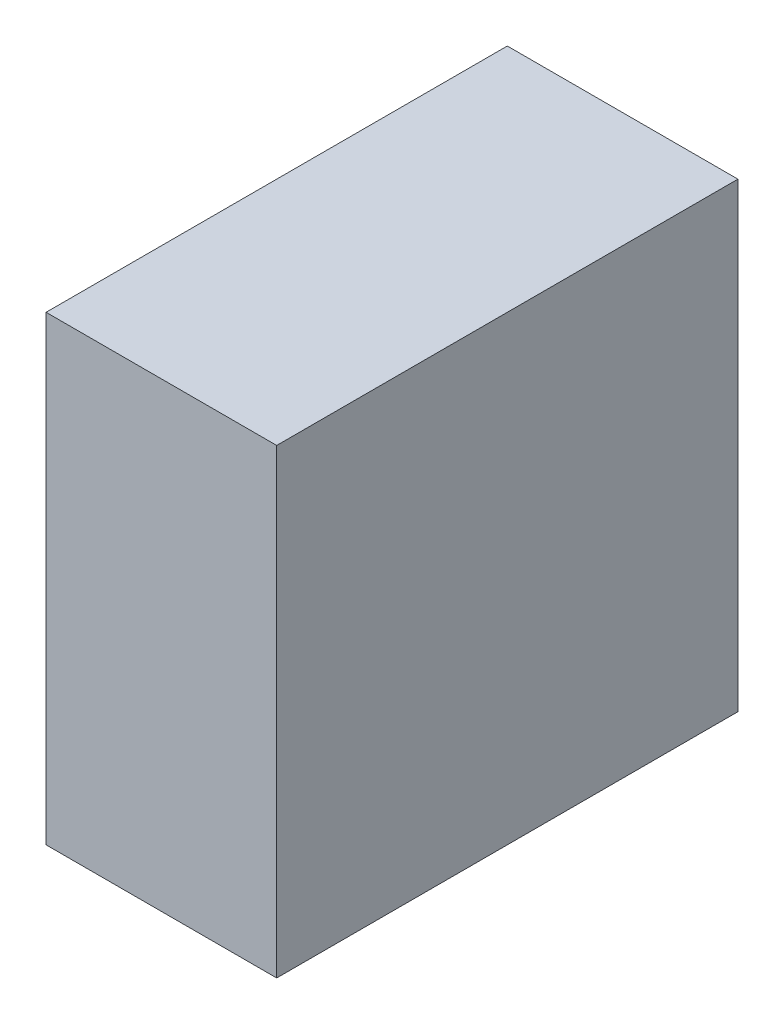
ISO-10303-21;
HEADER;
FILE_DESCRIPTION(('STEP AP214'),'2;1');
FILE_NAME('part.step','',(''),(''),'','','');
FILE_SCHEMA(('AUTOMOTIVE_DESIGN { 1 0 10303 214 1 1 1 1 }'));
ENDSEC;
DATA;
#1=APPLICATION_CONTEXT('core data for automotive mechanical design processes');
#2=APPLICATION_PROTOCOL_DEFINITION('international standard','automotive_design',2000,#1);
#3=PRODUCT_CONTEXT('',#1,'mechanical');
#4=PRODUCT('Part','Part','',(#3));
#5=PRODUCT_RELATED_PRODUCT_CATEGORY('part','',(#4));
#6=PRODUCT_DEFINITION_FORMATION('','',#4);
#7=PRODUCT_DEFINITION_CONTEXT('part definition',#1,'design');
#8=PRODUCT_DEFINITION('design','',#6,#7);
#9=PRODUCT_DEFINITION_SHAPE('','',#8);
#10=(LENGTH_UNIT() NAMED_UNIT(*) SI_UNIT(.MILLI.,.METRE.));
#11=(NAMED_UNIT(*) PLANE_ANGLE_UNIT() SI_UNIT($,.RADIAN.));
#12=(NAMED_UNIT(*) SI_UNIT($,.STERADIAN.) SOLID_ANGLE_UNIT());
#13=UNCERTAINTY_MEASURE_WITH_UNIT(LENGTH_MEASURE(1.E-05),#10,'distance_accuracy_value','');
#14=(GEOMETRIC_REPRESENTATION_CONTEXT(3) GLOBAL_UNCERTAINTY_ASSIGNED_CONTEXT((#13)) GLOBAL_UNIT_ASSIGNED_CONTEXT((#10,
#11,#12)) REPRESENTATION_CONTEXT('',''));
#15=CARTESIAN_POINT('',(0.,0.,0.));
#16=DIRECTION('',(0.,0.,1.));
#17=DIRECTION('',(1.,0.,0.));
#18=AXIS2_PLACEMENT_3D('',#15,#16,#17);
#19=CARTESIAN_POINT('',(128.,-15.,-15.));
#20=DIRECTION('',(-1.,0.,0.));
#21=DIRECTION('',(0.,0.,1.));
#22=AXIS2_PLACEMENT_3D('',#19,#20,#21);
#23=PLANE('',#22);
#24=DIRECTION('',(0.,-1.,0.));
#25=VECTOR('',#24,1.);
#26=CARTESIAN_POINT('',(128.,-15.,15.));
#27=LINE('',#26,#25);
#28=CARTESIAN_POINT('',(128.,15.,15.));
#29=VERTEX_POINT('',#28);
#30=CARTESIAN_POINT('',(128.,-15.,15.));
#31=VERTEX_POINT('',#30);
#32=EDGE_CURVE('E103',#29,#31,#27,.T.);
#33=ORIENTED_EDGE('',*,*,#32,.F.);
#34=DIRECTION('',(0.,0.,1.));
#35=VECTOR('',#34,1.);
#36=CARTESIAN_POINT('',(128.,15.,-15.));
#37=LINE('',#36,#35);
#38=CARTESIAN_POINT('',(128.,15.,-15.));
#39=VERTEX_POINT('',#38);
#40=EDGE_CURVE('E11',#39,#29,#37,.T.);
#41=ORIENTED_EDGE('',*,*,#40,.F.);
#42=DIRECTION('',(0.,-1.,0.));
#43=VECTOR('',#42,1.);
#44=CARTESIAN_POINT('',(128.,-15.,-15.));
#45=LINE('',#44,#43);
#46=CARTESIAN_POINT('',(128.,-15.,-15.));
#47=VERTEX_POINT('',#46);
#48=EDGE_CURVE('E97',#39,#47,#45,.T.);
#49=ORIENTED_EDGE('',*,*,#48,.T.);
#50=DIRECTION('',(0.,0.,1.));
#51=VECTOR('',#50,1.);
#52=CARTESIAN_POINT('',(128.,-15.,-15.));
#53=LINE('',#52,#51);
#54=EDGE_CURVE('E42',#47,#31,#53,.T.);
#55=ORIENTED_EDGE('',*,*,#54,.T.);
#56=EDGE_LOOP('',(#33,#41,#49,#55));
#57=FACE_BOUND('',#56,.T.);
#58=ADVANCED_FACE('F39',(#57),#23,.T.);
#59=CARTESIAN_POINT('',(128.,15.,-15.));
#60=DIRECTION('',(0.,1.,0.));
#61=DIRECTION('',(0.,0.,1.));
#62=AXIS2_PLACEMENT_3D('',#59,#60,#61);
#63=PLANE('',#62);
#64=DIRECTION('',(-1.,0.,0.));
#65=VECTOR('',#64,1.);
#66=CARTESIAN_POINT('',(128.,15.,15.));
#67=LINE('',#66,#65);
#68=CARTESIAN_POINT('',(143.,15.,15.));
#69=VERTEX_POINT('',#68);
#70=EDGE_CURVE('E99',#69,#29,#67,.T.);
#71=ORIENTED_EDGE('',*,*,#70,.F.);
#72=DIRECTION('',(0.,0.,1.));
#73=VECTOR('',#72,1.);
#74=CARTESIAN_POINT('',(143.,15.,-15.));
#75=LINE('',#74,#73);
#76=CARTESIAN_POINT('',(143.,15.,-15.));
#77=VERTEX_POINT('',#76);
#78=EDGE_CURVE('E48',#77,#69,#75,.T.);
#79=ORIENTED_EDGE('',*,*,#78,.F.);
#80=DIRECTION('',(-1.,0.,0.));
#81=VECTOR('',#80,1.);
#82=CARTESIAN_POINT('',(128.,15.,-15.));
#83=LINE('',#82,#81);
#84=EDGE_CURVE('E94',#77,#39,#83,.T.);
#85=ORIENTED_EDGE('',*,*,#84,.T.);
#86=ORIENTED_EDGE('',*,*,#40,.T.);
#87=EDGE_LOOP('',(#71,#79,#85,#86));
#88=FACE_BOUND('',#87,.T.);
#89=ADVANCED_FACE('F113',(#88),#63,.T.);
#90=CARTESIAN_POINT('',(143.,-15.,-15.));
#91=DIRECTION('',(1.,0.,0.));
#92=DIRECTION('',(0.,0.,-1.));
#93=AXIS2_PLACEMENT_3D('',#90,#91,#92);
#94=PLANE('',#93);
#95=DIRECTION('',(0.,1.,0.));
#96=VECTOR('',#95,1.);
#97=CARTESIAN_POINT('',(143.,-15.,15.));
#98=LINE('',#97,#96);
#99=CARTESIAN_POINT('',(143.,-15.,15.));
#100=VERTEX_POINT('',#99);
#101=EDGE_CURVE('E89',#100,#69,#98,.T.);
#102=ORIENTED_EDGE('',*,*,#101,.F.);
#103=DIRECTION('',(0.,0.,1.));
#104=VECTOR('',#103,1.);
#105=CARTESIAN_POINT('',(143.,-15.,-15.));
#106=LINE('',#105,#104);
#107=CARTESIAN_POINT('',(143.,-15.,-15.));
#108=VERTEX_POINT('',#107);
#109=EDGE_CURVE('E84',#108,#100,#106,.T.);
#110=ORIENTED_EDGE('',*,*,#109,.F.);
#111=DIRECTION('',(0.,1.,0.));
#112=VECTOR('',#111,1.);
#113=CARTESIAN_POINT('',(143.,-15.,-15.));
#114=LINE('',#113,#112);
#115=EDGE_CURVE('E87',#108,#77,#114,.T.);
#116=ORIENTED_EDGE('',*,*,#115,.T.);
#117=ORIENTED_EDGE('',*,*,#78,.T.);
#118=EDGE_LOOP('',(#102,#110,#116,#117));
#119=FACE_BOUND('',#118,.T.);
#120=ADVANCED_FACE('F86',(#119),#94,.T.);
#121=CARTESIAN_POINT('',(128.,-15.,-15.));
#122=DIRECTION('',(0.,-1.,0.));
#123=DIRECTION('',(0.,0.,-1.));
#124=AXIS2_PLACEMENT_3D('',#121,#122,#123);
#125=PLANE('',#124);
#126=DIRECTION('',(1.,0.,0.));
#127=VECTOR('',#126,1.);
#128=CARTESIAN_POINT('',(128.,-15.,15.));
#129=LINE('',#128,#127);
#130=EDGE_CURVE('E106',#31,#100,#129,.T.);
#131=ORIENTED_EDGE('',*,*,#130,.F.);
#132=ORIENTED_EDGE('',*,*,#54,.F.);
#133=DIRECTION('',(1.,0.,0.));
#134=VECTOR('',#133,1.);
#135=CARTESIAN_POINT('',(128.,-15.,-15.));
#136=LINE('',#135,#134);
#137=EDGE_CURVE('E93',#47,#108,#136,.T.);
#138=ORIENTED_EDGE('',*,*,#137,.T.);
#139=ORIENTED_EDGE('',*,*,#109,.T.);
#140=EDGE_LOOP('',(#131,#132,#138,#139));
#141=FACE_BOUND('',#140,.T.);
#142=ADVANCED_FACE('F96',(#141),#125,.T.);
#143=CARTESIAN_POINT('',(0.,0.,-15.));
#144=DIRECTION('',(0.,0.,-1.));
#145=DIRECTION('',(-1.,0.,0.));
#146=AXIS2_PLACEMENT_3D('',#143,#144,#145);
#147=PLANE('',#146);
#148=ORIENTED_EDGE('',*,*,#48,.F.);
#149=ORIENTED_EDGE('',*,*,#84,.F.);
#150=ORIENTED_EDGE('',*,*,#115,.F.);
#151=ORIENTED_EDGE('',*,*,#137,.F.);
#152=EDGE_LOOP('',(#148,#149,#150,#151));
#153=FACE_BOUND('',#152,.T.);
#154=ADVANCED_FACE('F92',(#153),#147,.T.);
#155=CARTESIAN_POINT('',(0.,0.,15.));
#156=DIRECTION('',(0.,0.,-1.));
#157=DIRECTION('',(-1.,0.,0.));
#158=AXIS2_PLACEMENT_3D('',#155,#156,#157);
#159=PLANE('',#158);
#160=ORIENTED_EDGE('',*,*,#32,.T.);
#161=ORIENTED_EDGE('',*,*,#130,.T.);
#162=ORIENTED_EDGE('',*,*,#101,.T.);
#163=ORIENTED_EDGE('',*,*,#70,.T.);
#164=EDGE_LOOP('',(#160,#161,#162,#163));
#165=FACE_BOUND('',#164,.T.);
#166=ADVANCED_FACE('F112',(#165),#159,.F.);
#167=CLOSED_SHELL('',(#58,#89,#120,#142,#154,#166));
#168=MANIFOLD_SOLID_BREP('B2',#167);
#169=ADVANCED_BREP_SHAPE_REPRESENTATION('',(#18,#168),#14);
#170=SHAPE_DEFINITION_REPRESENTATION(#9,#169);
ENDSEC;
END-ISO-10303-21;
